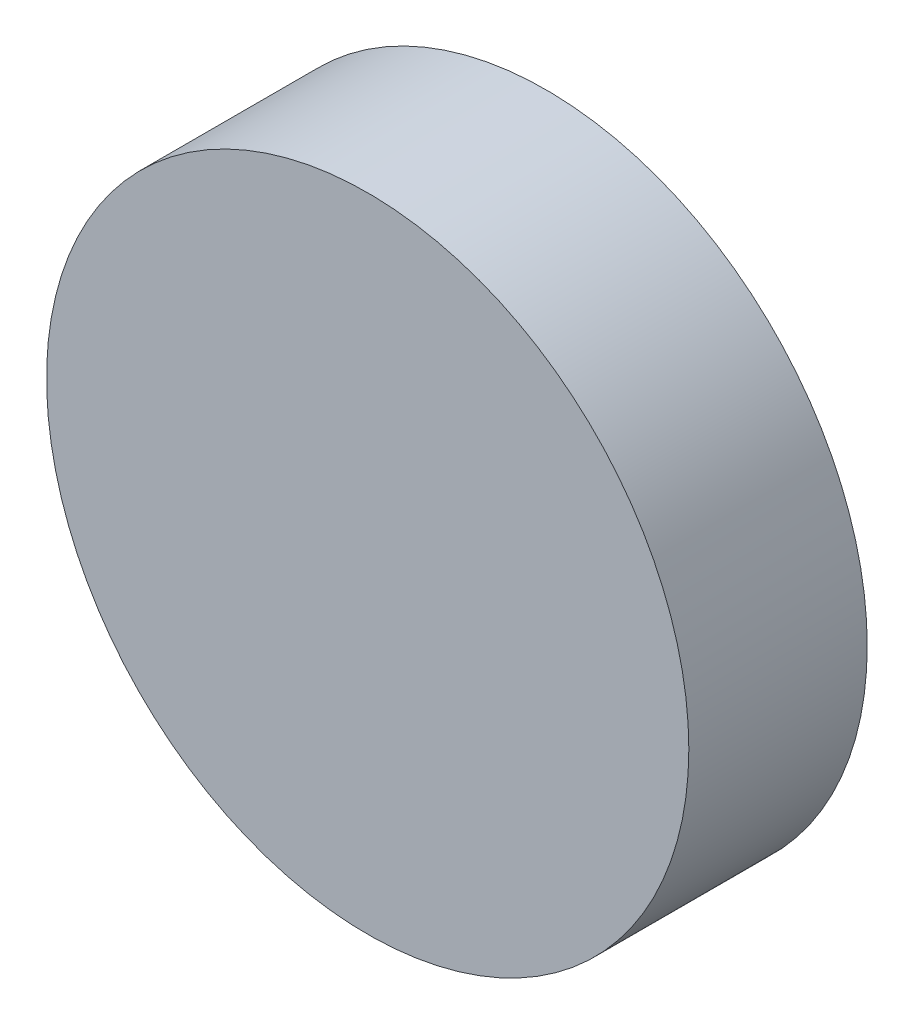
ISO-10303-21;
HEADER;
FILE_DESCRIPTION(('STEP AP214'),'2;1');
FILE_NAME('part.step','',(''),(''),'','','');
FILE_SCHEMA(('AUTOMOTIVE_DESIGN { 1 0 10303 214 1 1 1 1 }'));
ENDSEC;
DATA;
#1=APPLICATION_CONTEXT('core data for automotive mechanical design processes');
#2=APPLICATION_PROTOCOL_DEFINITION('international standard','automotive_design',2000,#1);
#3=PRODUCT_CONTEXT('',#1,'mechanical');
#4=PRODUCT('Part','Part','',(#3));
#5=PRODUCT_RELATED_PRODUCT_CATEGORY('part','',(#4));
#6=PRODUCT_DEFINITION_FORMATION('','',#4);
#7=PRODUCT_DEFINITION_CONTEXT('part definition',#1,'design');
#8=PRODUCT_DEFINITION('design','',#6,#7);
#9=PRODUCT_DEFINITION_SHAPE('','',#8);
#10=(LENGTH_UNIT() NAMED_UNIT(*) SI_UNIT(.MILLI.,.METRE.));
#11=(NAMED_UNIT(*) PLANE_ANGLE_UNIT() SI_UNIT($,.RADIAN.));
#12=(NAMED_UNIT(*) SI_UNIT($,.STERADIAN.) SOLID_ANGLE_UNIT());
#13=UNCERTAINTY_MEASURE_WITH_UNIT(LENGTH_MEASURE(1.E-05),#10,'distance_accuracy_value','');
#14=(GEOMETRIC_REPRESENTATION_CONTEXT(3) GLOBAL_UNCERTAINTY_ASSIGNED_CONTEXT((#13)) GLOBAL_UNIT_ASSIGNED_CONTEXT((#10,
#11,#12)) REPRESENTATION_CONTEXT('',''));
#15=CARTESIAN_POINT('',(0.,0.,0.));
#16=DIRECTION('',(0.,0.,1.));
#17=DIRECTION('',(1.,0.,0.));
#18=AXIS2_PLACEMENT_3D('',#15,#16,#17);
#19=CARTESIAN_POINT('',(0.,0.,5.));
#20=DIRECTION('',(0.,0.,-1.));
#21=DIRECTION('',(-1.,0.,0.));
#22=AXIS2_PLACEMENT_3D('',#19,#20,#21);
#23=CYLINDRICAL_SURFACE('',#22,9.);
#24=CARTESIAN_POINT('',(0.,0.,5.));
#25=DIRECTION('',(0.,0.,1.));
#26=DIRECTION('',(1.,0.,0.));
#27=AXIS2_PLACEMENT_3D('',#24,#25,#26);
#28=CIRCLE('',#27,9.);
#29=CARTESIAN_POINT('',(9.,0.,5.));
#30=VERTEX_POINT('',#29);
#31=EDGE_CURVE('E11',#30,#30,#28,.T.);
#32=ORIENTED_EDGE('',*,*,#31,.F.);
#33=EDGE_LOOP('',(#32));
#34=FACE_BOUND('',#33,.T.);
#35=CARTESIAN_POINT('',(0.,0.,0.));
#36=DIRECTION('',(0.,0.,1.));
#37=DIRECTION('',(1.,0.,0.));
#38=AXIS2_PLACEMENT_3D('',#35,#36,#37);
#39=CIRCLE('',#38,9.);
#40=CARTESIAN_POINT('',(9.,0.,0.));
#41=VERTEX_POINT('',#40);
#42=EDGE_CURVE('E36',#41,#41,#39,.T.);
#43=ORIENTED_EDGE('',*,*,#42,.T.);
#44=EDGE_LOOP('',(#43));
#45=FACE_BOUND('',#44,.T.);
#46=ADVANCED_FACE('F33',(#34,#45),#23,.T.);
#47=CARTESIAN_POINT('',(0.,0.,5.));
#48=DIRECTION('',(0.,0.,1.));
#49=DIRECTION('',(1.,0.,0.));
#50=AXIS2_PLACEMENT_3D('',#47,#48,#49);
#51=PLANE('',#50);
#52=ORIENTED_EDGE('',*,*,#31,.T.);
#53=EDGE_LOOP('',(#52));
#54=FACE_BOUND('',#53,.T.);
#55=ADVANCED_FACE('F49',(#54),#51,.T.);
#56=CARTESIAN_POINT('',(0.,0.,0.));
#57=DIRECTION('',(0.,0.,1.));
#58=DIRECTION('',(1.,0.,0.));
#59=AXIS2_PLACEMENT_3D('',#56,#57,#58);
#60=PLANE('',#59);
#61=ORIENTED_EDGE('',*,*,#42,.F.);
#62=EDGE_LOOP('',(#61));
#63=FACE_BOUND('',#62,.T.);
#64=ADVANCED_FACE('F47',(#63),#60,.F.);
#65=CLOSED_SHELL('',(#46,#55,#64));
#66=MANIFOLD_SOLID_BREP('B2',#65);
#67=ADVANCED_BREP_SHAPE_REPRESENTATION('',(#18,#66),#14);
#68=SHAPE_DEFINITION_REPRESENTATION(#9,#67);
ENDSEC;
END-ISO-10303-21;
